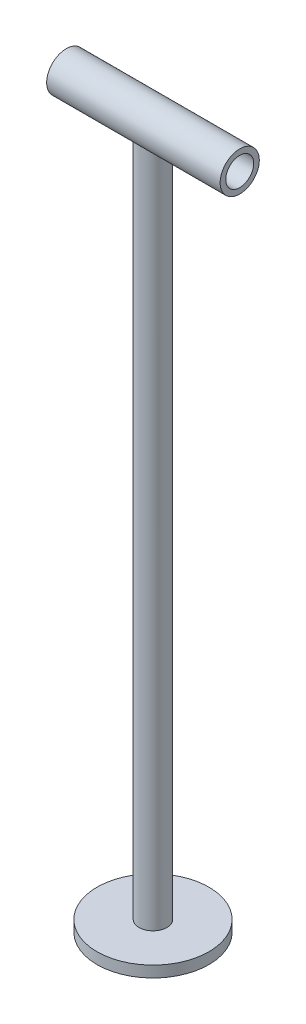
ISO-10303-21;
HEADER;
FILE_DESCRIPTION(('STEP AP214'),'2;1');
FILE_NAME('part.step','',(''),(''),'','','');
FILE_SCHEMA(('AUTOMOTIVE_DESIGN { 1 0 10303 214 1 1 1 1 }'));
ENDSEC;
DATA;
#1=APPLICATION_CONTEXT('core data for automotive mechanical design processes');
#2=APPLICATION_PROTOCOL_DEFINITION('international standard','automotive_design',2000,#1);
#3=PRODUCT_CONTEXT('',#1,'mechanical');
#4=PRODUCT('Part','Part','',(#3));
#5=PRODUCT_RELATED_PRODUCT_CATEGORY('part','',(#4));
#6=PRODUCT_DEFINITION_FORMATION('','',#4);
#7=PRODUCT_DEFINITION_CONTEXT('part definition',#1,'design');
#8=PRODUCT_DEFINITION('design','',#6,#7);
#9=PRODUCT_DEFINITION_SHAPE('','',#8);
#10=(LENGTH_UNIT() NAMED_UNIT(*) SI_UNIT(.MILLI.,.METRE.));
#11=(NAMED_UNIT(*) PLANE_ANGLE_UNIT() SI_UNIT($,.RADIAN.));
#12=(NAMED_UNIT(*) SI_UNIT($,.STERADIAN.) SOLID_ANGLE_UNIT());
#13=UNCERTAINTY_MEASURE_WITH_UNIT(LENGTH_MEASURE(1.E-05),#10,'distance_accuracy_value','');
#14=(GEOMETRIC_REPRESENTATION_CONTEXT(3) GLOBAL_UNCERTAINTY_ASSIGNED_CONTEXT((#13)) GLOBAL_UNIT_ASSIGNED_CONTEXT((#10,
#11,#12)) REPRESENTATION_CONTEXT('',''));
#15=CARTESIAN_POINT('',(0.,0.,0.));
#16=DIRECTION('',(0.,0.,1.));
#17=DIRECTION('',(1.,0.,0.));
#18=AXIS2_PLACEMENT_3D('',#15,#16,#17);
#19=CARTESIAN_POINT('',(-155.,1235.,0.));
#20=DIRECTION('',(1.,0.,0.));
#21=DIRECTION('',(0.,0.,-1.));
#22=AXIS2_PLACEMENT_3D('',#19,#20,#21);
#23=CYLINDRICAL_SURFACE('',#22,35.);
#24=CARTESIAN_POINT('',(-155.,1235.,0.));
#25=DIRECTION('',(1.,0.,0.));
#26=DIRECTION('',(0.,0.,-1.));
#27=AXIS2_PLACEMENT_3D('',#24,#25,#26);
#28=CIRCLE('',#27,35.);
#29=CARTESIAN_POINT('',(-155.,1235.,-35.));
#30=VERTEX_POINT('',#29);
#31=EDGE_CURVE('E11',#30,#30,#28,.T.);
#32=ORIENTED_EDGE('',*,*,#31,.T.);
#33=EDGE_LOOP('',(#32));
#34=FACE_BOUND('',#33,.T.);
#35=CARTESIAN_POINT('',(155.,1235.,0.));
#36=DIRECTION('',(1.,0.,0.));
#37=DIRECTION('',(0.,0.,-1.));
#38=AXIS2_PLACEMENT_3D('',#35,#36,#37);
#39=CIRCLE('',#38,35.);
#40=CARTESIAN_POINT('',(155.,1235.,-35.));
#41=VERTEX_POINT('',#40);
#42=EDGE_CURVE('E50',#41,#41,#39,.T.);
#43=ORIENTED_EDGE('',*,*,#42,.F.);
#44=EDGE_LOOP('',(#43));
#45=FACE_BOUND('',#44,.T.);
#46=ADVANCED_FACE('F40',(#34,#45),#23,.T.);
#47=CARTESIAN_POINT('',(-155.,1235.,0.));
#48=DIRECTION('',(1.,0.,0.));
#49=DIRECTION('',(0.,0.,-1.));
#50=AXIS2_PLACEMENT_3D('',#47,#48,#49);
#51=PLANE('',#50);
#52=CARTESIAN_POINT('',(-155.,1235.,0.));
#53=DIRECTION('',(1.,0.,0.));
#54=DIRECTION('',(0.,0.,-1.));
#55=AXIS2_PLACEMENT_3D('',#52,#53,#54);
#56=CIRCLE('',#55,25.);
#57=CARTESIAN_POINT('',(-155.,1235.,-25.));
#58=VERTEX_POINT('',#57);
#59=EDGE_CURVE('E46',#58,#58,#56,.T.);
#60=ORIENTED_EDGE('',*,*,#59,.T.);
#61=EDGE_LOOP('',(#60));
#62=FACE_BOUND('',#61,.T.);
#63=ORIENTED_EDGE('',*,*,#31,.F.);
#64=EDGE_LOOP('',(#63));
#65=FACE_BOUND('',#64,.T.);
#66=ADVANCED_FACE('F69',(#62,#65),#51,.F.);
#67=CARTESIAN_POINT('',(-155.,1235.,0.));
#68=DIRECTION('',(1.,0.,0.));
#69=DIRECTION('',(0.,0.,-1.));
#70=AXIS2_PLACEMENT_3D('',#67,#68,#69);
#71=CYLINDRICAL_SURFACE('',#70,25.);
#72=ORIENTED_EDGE('',*,*,#59,.F.);
#73=EDGE_LOOP('',(#72));
#74=FACE_BOUND('',#73,.T.);
#75=CARTESIAN_POINT('',(155.,1235.,0.));
#76=DIRECTION('',(1.,0.,0.));
#77=DIRECTION('',(0.,0.,-1.));
#78=AXIS2_PLACEMENT_3D('',#75,#76,#77);
#79=CIRCLE('',#78,25.);
#80=CARTESIAN_POINT('',(155.,1235.,-25.));
#81=VERTEX_POINT('',#80);
#82=EDGE_CURVE('E54',#81,#81,#79,.T.);
#83=ORIENTED_EDGE('',*,*,#82,.T.);
#84=EDGE_LOOP('',(#83));
#85=FACE_BOUND('',#84,.T.);
#86=ADVANCED_FACE('F60',(#74,#85),#71,.F.);
#87=CARTESIAN_POINT('',(155.,1235.,0.));
#88=DIRECTION('',(1.,0.,0.));
#89=DIRECTION('',(0.,0.,-1.));
#90=AXIS2_PLACEMENT_3D('',#87,#88,#89);
#91=PLANE('',#90);
#92=ORIENTED_EDGE('',*,*,#42,.T.);
#93=EDGE_LOOP('',(#92));
#94=FACE_BOUND('',#93,.T.);
#95=ORIENTED_EDGE('',*,*,#82,.F.);
#96=EDGE_LOOP('',(#95));
#97=FACE_BOUND('',#96,.T.);
#98=ADVANCED_FACE('F62',(#94,#97),#91,.T.);
#99=CLOSED_SHELL('',(#46,#66,#86,#98));
#100=MANIFOLD_SOLID_BREP('B2',#99);
#101=CARTESIAN_POINT('',(0.,-20.,0.));
#102=DIRECTION('',(0.,1.,0.));
#103=DIRECTION('',(0.,0.,1.));
#104=AXIS2_PLACEMENT_3D('',#101,#102,#103);
#105=CYLINDRICAL_SURFACE('',#104,100.);
#106=CARTESIAN_POINT('',(0.,-20.,0.));
#107=DIRECTION('',(0.,1.,0.));
#108=DIRECTION('',(0.,0.,1.));
#109=AXIS2_PLACEMENT_3D('',#106,#107,#108);
#110=CIRCLE('',#109,100.);
#111=CARTESIAN_POINT('',(0.,-20.,100.));
#112=VERTEX_POINT('',#111);
#113=EDGE_CURVE('E108',#112,#112,#110,.T.);
#114=ORIENTED_EDGE('',*,*,#113,.T.);
#115=EDGE_LOOP('',(#114));
#116=FACE_BOUND('',#115,.T.);
#117=CARTESIAN_POINT('',(0.,0.,0.));
#118=DIRECTION('',(0.,1.,0.));
#119=DIRECTION('',(0.,0.,1.));
#120=AXIS2_PLACEMENT_3D('',#117,#118,#119);
#121=CIRCLE('',#120,100.);
#122=CARTESIAN_POINT('',(0.,0.,100.));
#123=VERTEX_POINT('',#122);
#124=EDGE_CURVE('E104',#123,#123,#121,.T.);
#125=ORIENTED_EDGE('',*,*,#124,.F.);
#126=EDGE_LOOP('',(#125));
#127=FACE_BOUND('',#126,.T.);
#128=ADVANCED_FACE('F101',(#116,#127),#105,.T.);
#129=CARTESIAN_POINT('',(0.,-20.,0.));
#130=DIRECTION('',(0.,1.,0.));
#131=DIRECTION('',(0.,0.,1.));
#132=AXIS2_PLACEMENT_3D('',#129,#130,#131);
#133=PLANE('',#132);
#134=ORIENTED_EDGE('',*,*,#113,.F.);
#135=EDGE_LOOP('',(#134));
#136=FACE_BOUND('',#135,.T.);
#137=ADVANCED_FACE('F135',(#136),#133,.F.);
#138=CARTESIAN_POINT('',(0.,0.,0.));
#139=DIRECTION('',(0.,1.,0.));
#140=DIRECTION('',(0.,0.,1.));
#141=AXIS2_PLACEMENT_3D('',#138,#139,#140);
#142=PLANE('',#141);
#143=CARTESIAN_POINT('',(0.,0.,0.));
#144=DIRECTION('',(0.,1.,0.));
#145=DIRECTION('',(0.,0.,1.));
#146=AXIS2_PLACEMENT_3D('',#143,#144,#145);
#147=CIRCLE('',#146,25.);
#148=CARTESIAN_POINT('',(0.,0.,25.));
#149=VERTEX_POINT('',#148);
#150=EDGE_CURVE('E39',#149,#149,#147,.T.);
#151=ORIENTED_EDGE('',*,*,#150,.F.);
#152=EDGE_LOOP('',(#151));
#153=FACE_BOUND('',#152,.T.);
#154=ORIENTED_EDGE('',*,*,#124,.T.);
#155=EDGE_LOOP('',(#154));
#156=FACE_BOUND('',#155,.T.);
#157=ADVANCED_FACE('F131',(#153,#156),#142,.T.);
#158=CARTESIAN_POINT('',(0.,1270.001,0.));
#159=DIRECTION('',(0.,-1.,0.));
#160=DIRECTION('',(0.,0.,-1.));
#161=AXIS2_PLACEMENT_3D('',#158,#159,#160);
#162=CYLINDRICAL_SURFACE('',#161,25.);
#163=CARTESIAN_POINT('',(0.,1210.50510257217,-25.));
#164=CARTESIAN_POINT('',(0.595559906404479,1210.50510474988,-25.0000011951093));
#165=CARTESIAN_POINT('',(1.19110726281446,1210.48327756418,-24.9786715454106));
#166=CARTESIAN_POINT('',(2.37607226600176,1210.39722763199,-24.8939184235551));
#167=CARTESIAN_POINT('',(2.96548973142018,1210.33300363475,-24.8304937095523));
#168=CARTESIAN_POINT('',(4.13408177611065,1210.16544171306,-24.6629006635824));
#169=CARTESIAN_POINT('',(4.71323134638966,1210.06201919433,-24.5586441963227));
#170=CARTESIAN_POINT('',(5.85590137083453,1209.82105186546,-24.3115249626276));
#171=CARTESIAN_POINT('',(6.41942074044075,1209.68350469401,-24.1686595245178));
#172=CARTESIAN_POINT('',(7.52133126167754,1209.3817868113,-23.848581957746));
#173=CARTESIAN_POINT('',(8.05994316228457,1209.21795631187,-23.6718037265572));
#174=CARTESIAN_POINT('',(9.11749734575569,1208.86803341713,-23.2849374038769));
#175=CARTESIAN_POINT('',(9.63644017451958,1208.68194164026,-23.074850237689));
#176=CARTESIAN_POINT('',(10.6536057473573,1208.29272513566,-22.623224519263));
#177=CARTESIAN_POINT('',(11.1518333770458,1208.08960445863,-22.3816934391267));
#178=CARTESIAN_POINT('',(12.1271614777257,1207.67100393846,-21.8685991989694));
#179=CARTESIAN_POINT('',(12.6042603920219,1207.45552318735,-21.5970338312575));
#180=CARTESIAN_POINT('',(13.6228788919819,1206.97598708907,-20.9722900907901));
#181=CARTESIAN_POINT('',(14.160068155083,1206.71029792548,-20.6132941782485));
#182=CARTESIAN_POINT('',(15.203491370929,1206.17386689669,-19.8562174567148));
#183=CARTESIAN_POINT('',(15.7097229537879,1205.90312464672,-19.4581336615128));
#184=CARTESIAN_POINT('',(16.6908239814155,1205.36191607407,-18.6234177619393));
#185=CARTESIAN_POINT('',(17.1656530190978,1205.09145053144,-18.1867376185081));
#186=CARTESIAN_POINT('',(18.081806414408,1204.55638797843,-17.2761528938295));
#187=CARTESIAN_POINT('',(18.5231283242208,1204.2917913978,-16.8022455981418));
#188=CARTESIAN_POINT('',(19.4453459213236,1203.72755441065,-15.730939440998));
#189=CARTESIAN_POINT('',(19.9194236302348,1203.42999896547,-15.126528234036));
#190=CARTESIAN_POINT('',(20.8144437742202,1202.85777337165,-13.8691963875228));
#191=CARTESIAN_POINT('',(21.2353758392854,1202.5831076929,-13.2162663201219));
#192=CARTESIAN_POINT('',(22.0184585853897,1202.06481359314,-11.8657154833492));
#193=CARTESIAN_POINT('',(22.3807087239448,1201.82113281117,-11.1681731852311));
#194=CARTESIAN_POINT('',(22.8761906560005,1201.48424933741,-10.0913882167603));
#195=CARTESIAN_POINT('',(23.0333536454565,1201.37673859834,-9.72742525784962));
#196=CARTESIAN_POINT('',(23.3311277726877,1201.17205579965,-8.98980912171115));
#197=CARTESIAN_POINT('',(23.4717348588316,1201.07488627132,-8.61615359966657));
#198=CARTESIAN_POINT('',(23.7940507505523,1200.85123701128,-7.69264323449461));
#199=CARTESIAN_POINT('',(23.9664050831296,1200.73082087913,-7.13800325829544));
#200=CARTESIAN_POINT('',(24.2729689252471,1200.51572680958,-6.0135287927966));
#201=CARTESIAN_POINT('',(24.4071867886672,1200.42104323559,-5.44369766111485));
#202=CARTESIAN_POINT('',(24.6357050348254,1200.25936906724,-4.29256249642007));
#203=CARTESIAN_POINT('',(24.730030790883,1200.19236087064,-3.71126600297112));
#204=CARTESIAN_POINT('',(24.8775411622632,1200.08740393838,-2.54083803591875));
#205=CARTESIAN_POINT('',(24.930724357972,1200.04945620544,-1.95170629267535));
#206=CARTESIAN_POINT('',(24.9952137554182,1200.00342593767,-0.76871739147189));
#207=CARTESIAN_POINT('',(25.0064303416137,1199.99540731357,-0.174852831945018));
#208=CARTESIAN_POINT('',(24.9865643541006,1200.00959630351,1.01180047323049));
#209=CARTESIAN_POINT('',(24.9554819409792,1200.0318038028,1.60458922295486));
#210=CARTESIAN_POINT('',(24.851484528512,1200.10594667028,2.78472635014015));
#211=CARTESIAN_POINT('',(24.7785601816676,1200.15788868115,3.3720734821393));
#212=CARTESIAN_POINT('',(24.5919493702598,1200.29035207857,4.5369584803284));
#213=CARTESIAN_POINT('',(24.4782629543153,1200.37087343103,5.1144963582175));
#214=CARTESIAN_POINT('',(24.2151860128945,1200.55632464601,6.24104232516489));
#215=CARTESIAN_POINT('',(24.0668050967834,1200.66056239673,6.79040160592589));
#216=CARTESIAN_POINT('',(23.7346541369217,1200.89252748403,7.8731755540856));
#217=CARTESIAN_POINT('',(23.550884954754,1201.02025424874,8.4065906093064));
#218=CARTESIAN_POINT('',(23.1498933542044,1201.2969363042,9.45502480960263));
#219=CARTESIAN_POINT('',(22.9326684442501,1201.44589317598,9.97004258104193));
#220=CARTESIAN_POINT('',(22.4667785809201,1201.76256701401,10.9796640950827));
#221=CARTESIAN_POINT('',(22.2181117601203,1201.93028509448,11.4742666228487));
#222=CARTESIAN_POINT('',(21.6619223457074,1202.3015089978,12.4954303844769));
#223=CARTESIAN_POINT('',(21.3509289371567,1202.50692009534,13.019408646827));
#224=CARTESIAN_POINT('',(20.6950208878655,1202.93409991979,14.038641972588));
#225=CARTESIAN_POINT('',(20.3501041147404,1203.15586967478,14.5338952272625));
#226=CARTESIAN_POINT('',(19.62824974302,1203.61226512187,15.4949446290583));
#227=CARTESIAN_POINT('',(19.2512846996887,1203.84690177033,15.9607149205929));
#228=CARTESIAN_POINT('',(18.4674568552235,1204.32508302226,16.861480854806));
#229=CARTESIAN_POINT('',(18.0605925895666,1204.56862806178,17.2964749879564));
#230=CARTESIAN_POINT('',(17.1407348797498,1205.10617467699,18.2123771827241));
#231=CARTESIAN_POINT('',(16.6220106471424,1205.40119489551,18.6869483163744));
#232=CARTESIAN_POINT('',(15.5464965670885,1205.99152862461,19.5908147276406));
#233=CARTESIAN_POINT('',(14.9896991453005,1206.28684218198,20.0201009527585));
#234=CARTESIAN_POINT('',(13.8393376902345,1206.87027466759,20.8319079959141));
#235=CARTESIAN_POINT('',(13.2457710955894,1207.15839309264,21.2144255504805));
#236=CARTESIAN_POINT('',(12.0229071351632,1207.71896092986,21.9306077739893));
#237=CARTESIAN_POINT('',(11.3936195136979,1207.99141457478,22.2642856778331));
#238=CARTESIAN_POINT('',(10.2460184744867,1208.45248370581,22.8106754911882));
#239=CARTESIAN_POINT('',(9.73463692399214,1208.64616003872,23.0337049386508));
#240=CARTESIAN_POINT('',(8.69176575087188,1209.01329816502,23.4471264274111));
#241=CARTESIAN_POINT('',(8.16027822020635,1209.18676205382,23.637521852831));
#242=CARTESIAN_POINT('',(7.07934625539802,1209.50781763718,23.9834173107538));
#243=CARTESIAN_POINT('',(6.52993096515204,1209.65544906056,24.1389710328284));
#244=CARTESIAN_POINT('',(5.41459045702171,1209.91964050811,24.4133554613538));
#245=CARTESIAN_POINT('',(4.8486654112512,1210.03620085607,24.5321865504875));
#246=CARTESIAN_POINT('',(3.69688182424597,1210.23426729153,24.7321379397725));
#247=CARTESIAN_POINT('',(3.11086605694209,1210.31533879988,24.812791660092));
#248=CARTESIAN_POINT('',(1.93032649381178,1210.43617267191,24.9324229607897));
#249=CARTESIAN_POINT('',(1.33580312951673,1210.47593712333,24.9714026474626));
#250=CARTESIAN_POINT('',(0.144512529638529,1210.5119079119,25.0066792052881));
#251=CARTESIAN_POINT('',(-0.452253159532577,1210.50814016432,25.0030014709421));
#252=CARTESIAN_POINT('',(-1.64210722972361,1210.45731746567,24.9531158177881));
#253=CARTESIAN_POINT('',(-2.23519583520188,1210.4102651835,24.906910521221));
#254=CARTESIAN_POINT('',(-3.31848278960132,1210.28623679221,24.7837866571848));
#255=CARTESIAN_POINT('',(-3.8100773592583,1210.21519207163,24.7129034013135));
#256=CARTESIAN_POINT('',(-4.78398097623627,1210.0469165499,24.5429811338201));
#257=CARTESIAN_POINT('',(-5.26628667309046,1209.94967648291,24.4439321587292));
#258=CARTESIAN_POINT('',(-6.21957147920074,1209.73208689059,24.2189393424153));
#259=CARTESIAN_POINT('',(-6.69054236892516,1209.6117211318,24.0929766016431));
#260=CARTESIAN_POINT('',(-7.61942586746513,1209.35128061295,23.8155279575194));
#261=CARTESIAN_POINT('',(-8.07733524644025,1209.21120102801,23.6640358041633));
#262=CARTESIAN_POINT('',(-8.86183130905007,1208.95325939594,23.3793498202936));
#263=CARTESIAN_POINT('',(-9.19163829458405,1208.83907543123,23.2516216877341));
#264=CARTESIAN_POINT('',(-9.84314332092177,1208.60311914333,22.9833984685846));
#265=CARTESIAN_POINT('',(-10.1648428885371,1208.48134826416,22.8429058091455));
#266=CARTESIAN_POINT('',(-11.1178694220264,1208.10640376558,22.4027430152552));
#267=CARTESIAN_POINT('',(-11.7369528017062,1207.84365588053,22.0844506287848));
#268=CARTESIAN_POINT('',(-12.9420479777204,1207.30150770142,21.4005688884831));
#269=CARTESIAN_POINT('',(-13.5280030815863,1207.02208044901,21.0349017833412));
#270=CARTESIAN_POINT('',(-14.6649740465762,1206.4549688196,20.2586333121862));
#271=CARTESIAN_POINT('',(-15.215994081922,1206.16728543508,19.8480373305481));
#272=CARTESIAN_POINT('',(-16.2941726973816,1205.58419091229,18.9734725971167));
#273=CARTESIAN_POINT('',(-16.8205051263815,1205.28875265561,18.5085034609367));
#274=CARTESIAN_POINT('',(-17.8338750119385,1204.70353065067,17.5341648257475));
#275=CARTESIAN_POINT('',(-18.3209096160228,1204.41374731402,17.0247921092316));
#276=CARTESIAN_POINT('',(-19.252667346333,1203.84668931363,15.9634833090006));
#277=CARTESIAN_POINT('',(-19.6974416297497,1203.56939974541,15.4116001899759));
#278=CARTESIAN_POINT('',(-20.5421970718293,1203.03321448183,14.2661941558615));
#279=CARTESIAN_POINT('',(-20.9421858445164,1202.77431566259,13.6726783467739));
#280=CARTESIAN_POINT('',(-21.6379848256756,1202.31752502467,12.5368695003532));
#281=CARTESIAN_POINT('',(-21.940451727491,1202.11627550726,11.9999991880607));
#282=CARTESIAN_POINT('',(-22.5075250263594,1201.73523518639,10.899288191828));
#283=CARTESIAN_POINT('',(-22.7721346560189,1201.55544255094,10.3354498161647));
#284=CARTESIAN_POINT('',(-23.2606133150532,1201.22094637541,9.18341578429583));
#285=CARTESIAN_POINT('',(-23.4844975910864,1201.06623344841,8.59522934511558));
#286=CARTESIAN_POINT('',(-23.88884537715,1200.78515230313,7.39746823890797));
#287=CARTESIAN_POINT('',(-24.0693086261552,1200.65878425525,6.78789344332988));
#288=CARTESIAN_POINT('',(-24.3852293486114,1200.43662772875,5.54733115956759));
#289=CARTESIAN_POINT('',(-24.5203867972605,1200.34104326295,4.91623028253545));
#290=CARTESIAN_POINT('',(-24.7418595930403,1200.18400499602,3.64128574615881));
#291=CARTESIAN_POINT('',(-24.8281747005135,1200.12255136236,2.99744202430432));
#292=CARTESIAN_POINT('',(-24.9504084738358,1200.03543160743,1.70284065171955));
#293=CARTESIAN_POINT('',(-24.986348320512,1200.00975044526,1.05208602279068));
#294=CARTESIAN_POINT('',(-25.0072279070573,1199.99483781923,-0.250627355566789));
#295=CARTESIAN_POINT('',(-24.9921722884338,1200.00560303809,-0.902585990010901));
#296=CARTESIAN_POINT('',(-24.9157187649193,1200.06015950921,-2.13176295207646));
#297=CARTESIAN_POINT('',(-24.8594804716986,1200.10027332769,-2.70947660819424));
#298=CARTESIAN_POINT('',(-24.7074604477746,1200.20839556065,-3.85698118074642));
#299=CARTESIAN_POINT('',(-24.6116820798084,1200.276401603,-4.42677276666495));
#300=CARTESIAN_POINT('',(-24.3818771573251,1200.43890422321,-5.55476786239295));
#301=CARTESIAN_POINT('',(-24.2478467126552,1200.53340349536,-6.11297018740288));
#302=CARTESIAN_POINT('',(-23.9432241310417,1200.74702644586,-7.21447108773238));
#303=CARTESIAN_POINT('',(-23.7726302977854,1200.86615126667,-7.75776897025941));
#304=CARTESIAN_POINT('',(-23.3924109694185,1201.12987011715,-8.83919036466114));
#305=CARTESIAN_POINT('',(-23.1819655016879,1201.27499492528,-9.37689526658711));
#306=CARTESIAN_POINT('',(-22.7269879842567,1201.58610420366,-10.4313855731541));
#307=CARTESIAN_POINT('',(-22.4824558229265,1201.75208874221,-10.9481709092789));
#308=CARTESIAN_POINT('',(-21.9614688826655,1202.102144627,-11.9589798709535));
#309=CARTESIAN_POINT('',(-21.6850139137935,1202.28621608086,-12.4530033610453));
#310=CARTESIAN_POINT('',(-21.1022063247259,1202.66959727852,-13.4169364200684));
#311=CARTESIAN_POINT('',(-20.7958499605418,1202.8689089299,-13.8868429580196));
#312=CARTESIAN_POINT('',(-20.1057135017863,1203.31152949368,-14.8719733229268));
#313=CARTESIAN_POINT('',(-19.7172777021605,1203.55688505488,-15.3830199749959));
#314=CARTESIAN_POINT('',(-18.9055289200594,1204.05945369176,-16.37038627757));
#315=CARTESIAN_POINT('',(-18.4822129288838,1204.31666778949,-16.8467029256359));
#316=CARTESIAN_POINT('',(-17.6019329320917,1204.83873029737,-17.7644862873002));
#317=CARTESIAN_POINT('',(-17.144911625824,1205.10359121975,-18.2058908804999));
#318=CARTESIAN_POINT('',(-16.199392715548,1205.63560696308,-19.0520930691918));
#319=CARTESIAN_POINT('',(-15.7108933221747,1205.90276191369,-19.4568885804997));
#320=CARTESIAN_POINT('',(-14.6166831768188,1206.47991100431,-20.2954708760124));
#321=CARTESIAN_POINT('',(-14.0052777495625,1206.78935656023,-20.7222385608691));
#322=CARTESIAN_POINT('',(-12.7417814652563,1207.39482868453,-21.5222264424292));
#323=CARTESIAN_POINT('',(-12.0896802496211,1207.69085180302,-21.895432925401));
#324=CARTESIAN_POINT('',(-10.7468638854326,1208.25817459388,-22.5848127231806));
#325=CARTESIAN_POINT('',(-10.0562016776878,1208.52950688026,-22.9010618301001));
#326=CARTESIAN_POINT('',(-8.63733296022225,1209.03531183337,-23.4729800829363));
#327=CARTESIAN_POINT('',(-7.90914532355428,1209.26980279339,-23.7286793266565));
#328=CARTESIAN_POINT('',(-6.59576324752919,1209.63848043727,-24.1215209852126));
#329=CARTESIAN_POINT('',(-6.0176435399423,1209.78326473805,-24.272398155952));
#330=CARTESIAN_POINT('',(-4.84456534221541,1210.03718183936,-24.5334664331865));
#331=CARTESIAN_POINT('',(-4.24961002144098,1210.14632130227,-24.6436651434071));
#332=CARTESIAN_POINT('',(-3.04884484033382,1210.32320888962,-24.8207923990897));
#333=CARTESIAN_POINT('',(-2.44306958797425,1210.39107076109,-24.8878398846021));
#334=CARTESIAN_POINT('',(-1.22485818832014,1210.48201508645,-24.9774416832852));
#335=CARTESIAN_POINT('',(-0.612422458794557,1210.5051003328,-24.9999987710526));
#336=CARTESIAN_POINT('',(0.,1210.50510257217,-25.));
#337=B_SPLINE_CURVE_WITH_KNOTS('',3,(#163,#164,#165,#166,#167,#168,#169,#170,#171,#172,#173,
#174,#175,#176,#177,#178,#179,#180,#181,#182,#183,#184,#185,#186,#187,#188,#189,#190,#191,#192,
#193,#194,#195,#196,#197,#198,#199,#200,#201,#202,#203,#204,#205,#206,#207,#208,#209,#210,#211,
#212,#213,#214,#215,#216,#217,#218,#219,#220,#221,#222,#223,#224,#225,#226,#227,#228,#229,#230,
#231,#232,#233,#234,#235,#236,#237,#238,#239,#240,#241,#242,#243,#244,#245,#246,#247,#248,#249,
#250,#251,#252,#253,#254,#255,#256,#257,#258,#259,#260,#261,#262,#263,#264,#265,#266,#267,#268,
#269,#270,#271,#272,#273,#274,#275,#276,#277,#278,#279,#280,#281,#282,#283,#284,#285,#286,#287,
#288,#289,#290,#291,#292,#293,#294,#295,#296,#297,#298,#299,#300,#301,#302,#303,#304,#305,#306,
#307,#308,#309,#310,#311,#312,#313,#314,#315,#316,#317,#318,#319,#320,#321,#322,#323,#324,#325,
#326,#327,#328,#329,#330,#331,#332,#333,#334,#335,#336),.UNSPECIFIED.,.T.,.F.,(4,2,2,2,2,2,2,2,
2,2,2,2,2,2,2,2,2,2,2,2,2,2,2,2,2,2,2,2,2,2,2,2,2,2,2,2,2,2,2,2,2,2,2,2,2,2,2,2,2,2,2,2,2,2,2,2,
2,2,2,2,2,2,2,2,2,2,2,2,2,2,2,2,2,2,2,2,2,2,2,2,2,2,2,2,2,2,4),(0.,1.78589612183631,
3.57184493171814,5.3616701465024,7.15161924584487,8.92003378085616,10.6883991989021,
12.456345159962,14.2244211615798,16.318316707004,18.4123723451081,20.5090720813942,
22.6059248419727,25.0738551564098,27.5422662823543,30.0064490124967,31.2382548619251,
32.4703615403397,34.247826754161,36.0249023095028,37.8008458522544,39.5768506707639,
41.3566458143828,43.1364342010647,44.9166203478171,46.6968043712558,48.4305132882411,
50.1641800006897,51.8979758882227,53.6318747992175,55.5590446605933,57.4863357392124,
59.4152942188394,61.3443472457314,63.629322990858,65.914754642761,68.2003456789021,
70.48531619873,72.2555933128706,74.0256867394651,75.793033469799,77.5603617821619,
79.3487646226248,81.1370770691165,82.9243249652979,84.7114626675159,86.2150838899895,
87.7192376733282,89.2244512047477,90.7300337730416,91.8446035346657,92.9589618047112,
95.1882503683975,97.4212451162526,99.6539725496066,101.937408517221,104.221010081548,
106.501811096778,108.782223760345,110.725074434681,112.667759111189,114.609714986537,
116.551682535648,118.506267242421,120.460861539779,122.414633759898,124.368228156275,
126.111660266766,127.854944135341,129.598405355302,131.341947478483,133.126290851097,
134.910640067352,136.694999901063,138.479583443856,140.5392033713,142.599001144082,
144.662385188878,146.725886629932,149.144873601926,151.564478827054,153.980840149075,
156.395997825892,158.238016744587,160.07969117367,161.91626730582,163.752728898222),.UNSPECIFIED.);
#338=CARTESIAN_POINT('',(0.,1210.50510257217,-25.));
#339=VERTEX_POINT('',#338);
#340=EDGE_CURVE('E114',#339,#339,#337,.T.);
#341=ORIENTED_EDGE('',*,*,#340,.T.);
#342=EDGE_LOOP('',(#341));
#343=FACE_BOUND('',#342,.T.);
#344=ORIENTED_EDGE('',*,*,#150,.T.);
#345=EDGE_LOOP('',(#344));
#346=FACE_BOUND('',#345,.T.);
#347=ADVANCED_FACE('F121',(#343,#346),#162,.T.);
#348=CARTESIAN_POINT('',(-155.,1235.,0.));
#349=DIRECTION('',(1.,0.,0.));
#350=DIRECTION('',(0.,0.,-1.));
#351=AXIS2_PLACEMENT_3D('',#348,#349,#350);
#352=CYLINDRICAL_SURFACE('',#351,35.);
#353=ORIENTED_EDGE('',*,*,#340,.F.);
#354=EDGE_LOOP('',(#353));
#355=FACE_BOUND('',#354,.T.);
#356=ADVANCED_FACE('F124',(#355),#352,.F.);
#357=CLOSED_SHELL('',(#128,#137,#157,#347,#356));
#358=MANIFOLD_SOLID_BREP('B6',#357);
#359=ADVANCED_BREP_SHAPE_REPRESENTATION('',(#18,#100,#358),#14);
#360=SHAPE_DEFINITION_REPRESENTATION(#9,#359);
ENDSEC;
END-ISO-10303-21;
